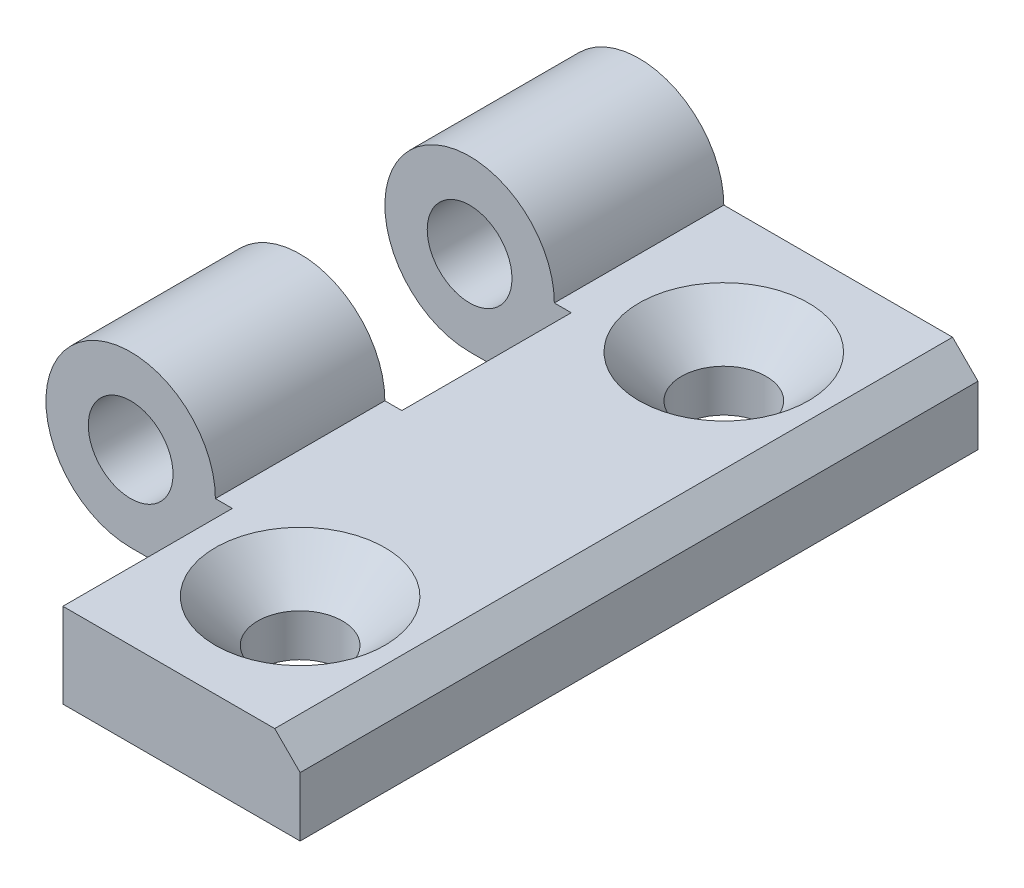
ISO-10303-21;
HEADER;
FILE_DESCRIPTION(('STEP AP214'),'2;1');
FILE_NAME('part.step','',(''),(''),'','','');
FILE_SCHEMA(('AUTOMOTIVE_DESIGN { 1 0 10303 214 1 1 1 1 }'));
ENDSEC;
DATA;
#1=APPLICATION_CONTEXT('core data for automotive mechanical design processes');
#2=APPLICATION_PROTOCOL_DEFINITION('international standard','automotive_design',2000,#1);
#3=PRODUCT_CONTEXT('',#1,'mechanical');
#4=PRODUCT('Part','Part','',(#3));
#5=PRODUCT_RELATED_PRODUCT_CATEGORY('part','',(#4));
#6=PRODUCT_DEFINITION_FORMATION('','',#4);
#7=PRODUCT_DEFINITION_CONTEXT('part definition',#1,'design');
#8=PRODUCT_DEFINITION('design','',#6,#7);
#9=PRODUCT_DEFINITION_SHAPE('','',#8);
#10=(LENGTH_UNIT() NAMED_UNIT(*) SI_UNIT(.MILLI.,.METRE.));
#11=(NAMED_UNIT(*) PLANE_ANGLE_UNIT() SI_UNIT($,.RADIAN.));
#12=(NAMED_UNIT(*) SI_UNIT($,.STERADIAN.) SOLID_ANGLE_UNIT());
#13=UNCERTAINTY_MEASURE_WITH_UNIT(LENGTH_MEASURE(1.E-05),#10,'distance_accuracy_value','');
#14=(GEOMETRIC_REPRESENTATION_CONTEXT(3) GLOBAL_UNCERTAINTY_ASSIGNED_CONTEXT((#13)) GLOBAL_UNIT_ASSIGNED_CONTEXT((#10,
#11,#12)) REPRESENTATION_CONTEXT('',''));
#15=CARTESIAN_POINT('',(0.,0.,0.));
#16=DIRECTION('',(0.,0.,1.));
#17=DIRECTION('',(1.,0.,0.));
#18=AXIS2_PLACEMENT_3D('',#15,#16,#17);
#19=CARTESIAN_POINT('',(-13.,2.5,40.));
#20=DIRECTION('',(0.,0.,-1.));
#21=DIRECTION('',(-1.,0.,0.));
#22=AXIS2_PLACEMENT_3D('',#19,#20,#21);
#23=CYLINDRICAL_SURFACE('',#22,5.);
#24=DIRECTION('',(0.,0.,-1.));
#25=VECTOR('',#24,1.);
#26=CARTESIAN_POINT('',(-13.,-2.5,40.));
#27=LINE('',#26,#25);
#28=CARTESIAN_POINT('',(-13.,-2.5,10.));
#29=VERTEX_POINT('',#28);
#30=CARTESIAN_POINT('',(-13.,-2.5,0.));
#31=VERTEX_POINT('',#30);
#32=EDGE_CURVE('E184',#29,#31,#27,.T.);
#33=ORIENTED_EDGE('',*,*,#32,.F.);
#34=CARTESIAN_POINT('',(-13.,2.5,10.));
#35=DIRECTION('',(0.,0.,1.));
#36=DIRECTION('',(1.,0.,0.));
#37=AXIS2_PLACEMENT_3D('',#34,#35,#36);
#38=CIRCLE('',#37,5.);
#39=CARTESIAN_POINT('',(-8.,2.5,10.));
#40=VERTEX_POINT('',#39);
#41=EDGE_CURVE('E222',#29,#40,#38,.F.);
#42=ORIENTED_EDGE('',*,*,#41,.T.);
#43=DIRECTION('',(0.,0.,-1.));
#44=VECTOR('',#43,1.);
#45=CARTESIAN_POINT('',(-8.,2.5,40.));
#46=LINE('',#45,#44);
#47=CARTESIAN_POINT('',(-8.,2.5,0.));
#48=VERTEX_POINT('',#47);
#49=EDGE_CURVE('E179',#40,#48,#46,.T.);
#50=ORIENTED_EDGE('',*,*,#49,.T.);
#51=CARTESIAN_POINT('',(-13.,2.5,0.));
#52=DIRECTION('',(0.,0.,-1.));
#53=DIRECTION('',(-1.,0.,0.));
#54=AXIS2_PLACEMENT_3D('',#51,#52,#53);
#55=CIRCLE('',#54,5.);
#56=EDGE_CURVE('E176',#31,#48,#55,.T.);
#57=ORIENTED_EDGE('',*,*,#56,.F.);
#58=EDGE_LOOP('',(#33,#42,#50,#57));
#59=FACE_BOUND('',#58,.T.);
#60=ADVANCED_FACE('F35',(#59),#23,.T.);
#61=CARTESIAN_POINT('',(-13.,2.5,40.));
#62=DIRECTION('',(0.,0.,-1.));
#63=DIRECTION('',(-1.,0.,0.));
#64=AXIS2_PLACEMENT_3D('',#61,#62,#63);
#65=CYLINDRICAL_SURFACE('',#64,2.5);
#66=CARTESIAN_POINT('',(-13.,2.5,0.));
#67=DIRECTION('',(0.,0.,-1.));
#68=DIRECTION('',(-1.,0.,0.));
#69=AXIS2_PLACEMENT_3D('',#66,#67,#68);
#70=CIRCLE('',#69,2.5);
#71=CARTESIAN_POINT('',(-15.5,2.5,0.));
#72=VERTEX_POINT('',#71);
#73=EDGE_CURVE('E173',#72,#72,#70,.T.);
#74=ORIENTED_EDGE('',*,*,#73,.T.);
#75=EDGE_LOOP('',(#74));
#76=FACE_BOUND('',#75,.T.);
#77=CARTESIAN_POINT('',(-13.,2.5,10.));
#78=DIRECTION('',(0.,0.,1.));
#79=DIRECTION('',(1.,0.,0.));
#80=AXIS2_PLACEMENT_3D('',#77,#78,#79);
#81=CIRCLE('',#80,2.5);
#82=CARTESIAN_POINT('',(-10.5,2.5,10.));
#83=VERTEX_POINT('',#82);
#84=EDGE_CURVE('E148',#83,#83,#81,.F.);
#85=ORIENTED_EDGE('',*,*,#84,.F.);
#86=EDGE_LOOP('',(#85));
#87=FACE_BOUND('',#86,.T.);
#88=ADVANCED_FACE('F254',(#76,#87),#65,.F.);
#89=CARTESIAN_POINT('',(-7.,2.5,40.));
#90=DIRECTION('',(0.,-1.,0.));
#91=DIRECTION('',(0.,0.,-1.));
#92=AXIS2_PLACEMENT_3D('',#89,#90,#91);
#93=PLANE('',#92);
#94=CARTESIAN_POINT('',(-0.500000000000004,2.5,32.5));
#95=DIRECTION('',(0.,1.,0.));
#96=DIRECTION('',(0.,0.,1.));
#97=AXIS2_PLACEMENT_3D('',#94,#95,#96);
#98=CIRCLE('',#97,5.);
#99=CARTESIAN_POINT('',(-0.500000000000004,2.5,37.5));
#100=VERTEX_POINT('',#99);
#101=EDGE_CURVE('E245',#100,#100,#98,.T.);
#102=ORIENTED_EDGE('',*,*,#101,.F.);
#103=EDGE_LOOP('',(#102));
#104=FACE_BOUND('',#103,.T.);
#105=CARTESIAN_POINT('',(-0.500000000000003,2.5,7.5));
#106=DIRECTION('',(0.,1.,0.));
#107=DIRECTION('',(0.,0.,1.));
#108=AXIS2_PLACEMENT_3D('',#105,#106,#107);
#109=CIRCLE('',#108,5.);
#110=CARTESIAN_POINT('',(-0.500000000000003,2.5,12.5));
#111=VERTEX_POINT('',#110);
#112=EDGE_CURVE('E236',#111,#111,#109,.T.);
#113=ORIENTED_EDGE('',*,*,#112,.F.);
#114=EDGE_LOOP('',(#113));
#115=FACE_BOUND('',#114,.T.);
#116=DIRECTION('',(-1.,0.,0.));
#117=VECTOR('',#116,1.);
#118=CARTESIAN_POINT('',(-7.,2.5,40.));
#119=LINE('',#118,#117);
#120=CARTESIAN_POINT('',(5.5,2.5,40.));
#121=VERTEX_POINT('',#120);
#122=CARTESIAN_POINT('',(-7.,2.5,40.));
#123=VERTEX_POINT('',#122);
#124=EDGE_CURVE('E189',#121,#123,#119,.T.);
#125=ORIENTED_EDGE('',*,*,#124,.F.);
#126=DIRECTION('',(0.,0.,-1.));
#127=VECTOR('',#126,1.);
#128=CARTESIAN_POINT('',(5.5,2.5,40.));
#129=LINE('',#128,#127);
#130=CARTESIAN_POINT('',(5.5,2.5,0.));
#131=VERTEX_POINT('',#130);
#132=EDGE_CURVE('E208',#121,#131,#129,.T.);
#133=ORIENTED_EDGE('',*,*,#132,.T.);
#134=DIRECTION('',(-1.,0.,0.));
#135=VECTOR('',#134,1.);
#136=CARTESIAN_POINT('',(-7.,2.5,0.));
#137=LINE('',#136,#135);
#138=EDGE_CURVE('E196',#131,#48,#137,.T.);
#139=ORIENTED_EDGE('',*,*,#138,.T.);
#140=ORIENTED_EDGE('',*,*,#49,.F.);
#141=DIRECTION('',(-1.,0.,0.));
#142=VECTOR('',#141,1.);
#143=CARTESIAN_POINT('',(-7.,2.5,10.));
#144=LINE('',#143,#142);
#145=CARTESIAN_POINT('',(-7.,2.5,10.));
#146=VERTEX_POINT('',#145);
#147=EDGE_CURVE('E146',#146,#40,#144,.T.);
#148=ORIENTED_EDGE('',*,*,#147,.F.);
#149=DIRECTION('',(0.,0.,1.));
#150=VECTOR('',#149,1.);
#151=CARTESIAN_POINT('',(-7.,2.5,40.));
#152=LINE('',#151,#150);
#153=CARTESIAN_POINT('',(-7.,2.5,20.));
#154=VERTEX_POINT('',#153);
#155=EDGE_CURVE('E134',#146,#154,#152,.T.);
#156=ORIENTED_EDGE('',*,*,#155,.T.);
#157=DIRECTION('',(-1.,0.,0.));
#158=VECTOR('',#157,1.);
#159=CARTESIAN_POINT('',(-7.,2.5,20.));
#160=LINE('',#159,#158);
#161=CARTESIAN_POINT('',(-8.,2.5,20.));
#162=VERTEX_POINT('',#161);
#163=EDGE_CURVE('E117',#154,#162,#160,.T.);
#164=ORIENTED_EDGE('',*,*,#163,.T.);
#165=CARTESIAN_POINT('',(-8.,2.5,30.));
#166=VERTEX_POINT('',#165);
#167=EDGE_CURVE('E185',#166,#162,#46,.T.);
#168=ORIENTED_EDGE('',*,*,#167,.F.);
#169=DIRECTION('',(-1.,0.,0.));
#170=VECTOR('',#169,1.);
#171=CARTESIAN_POINT('',(-7.,2.5,30.));
#172=LINE('',#171,#170);
#173=CARTESIAN_POINT('',(-7.,2.5,30.));
#174=VERTEX_POINT('',#173);
#175=EDGE_CURVE('E165',#174,#166,#172,.T.);
#176=ORIENTED_EDGE('',*,*,#175,.F.);
#177=DIRECTION('',(0.,0.,1.));
#178=VECTOR('',#177,1.);
#179=CARTESIAN_POINT('',(-7.,2.5,40.));
#180=LINE('',#179,#178);
#181=EDGE_CURVE('E170',#174,#123,#180,.T.);
#182=ORIENTED_EDGE('',*,*,#181,.T.);
#183=EDGE_LOOP('',(#125,#133,#139,#140,#148,#156,#164,#168,#176,#182));
#184=FACE_BOUND('',#183,.T.);
#185=ADVANCED_FACE('F144',(#104,#115,#184),#93,.F.);
#186=CARTESIAN_POINT('',(-7.,-2.5,40.));
#187=DIRECTION('',(0.,1.,0.));
#188=DIRECTION('',(0.,0.,1.));
#189=AXIS2_PLACEMENT_3D('',#186,#187,#188);
#190=PLANE('',#189);
#191=CARTESIAN_POINT('',(-0.500000000000004,-2.5,32.5));
#192=DIRECTION('',(0.,1.,0.));
#193=DIRECTION('',(0.,0.,1.));
#194=AXIS2_PLACEMENT_3D('',#191,#192,#193);
#195=CIRCLE('',#194,2.5);
#196=CARTESIAN_POINT('',(-0.500000000000004,-2.5,35.));
#197=VERTEX_POINT('',#196);
#198=EDGE_CURVE('E239',#197,#197,#195,.T.);
#199=ORIENTED_EDGE('',*,*,#198,.T.);
#200=EDGE_LOOP('',(#199));
#201=FACE_BOUND('',#200,.T.);
#202=CARTESIAN_POINT('',(-0.500000000000003,-2.5,7.5));
#203=DIRECTION('',(0.,1.,0.));
#204=DIRECTION('',(0.,0.,1.));
#205=AXIS2_PLACEMENT_3D('',#202,#203,#204);
#206=CIRCLE('',#205,2.5);
#207=CARTESIAN_POINT('',(-0.500000000000003,-2.5,10.));
#208=VERTEX_POINT('',#207);
#209=EDGE_CURVE('E140',#208,#208,#206,.T.);
#210=ORIENTED_EDGE('',*,*,#209,.T.);
#211=EDGE_LOOP('',(#210));
#212=FACE_BOUND('',#211,.T.);
#213=DIRECTION('',(1.,0.,0.));
#214=VECTOR('',#213,1.);
#215=CARTESIAN_POINT('',(-7.,-2.5,10.));
#216=LINE('',#215,#214);
#217=CARTESIAN_POINT('',(-7.,-2.5,10.));
#218=VERTEX_POINT('',#217);
#219=EDGE_CURVE('E206',#29,#218,#216,.T.);
#220=ORIENTED_EDGE('',*,*,#219,.F.);
#221=ORIENTED_EDGE('',*,*,#32,.T.);
#222=DIRECTION('',(1.,0.,0.));
#223=VECTOR('',#222,1.);
#224=CARTESIAN_POINT('',(-7.,-2.5,0.));
#225=LINE('',#224,#223);
#226=CARTESIAN_POINT('',(7.,-2.5,0.));
#227=VERTEX_POINT('',#226);
#228=EDGE_CURVE('E190',#31,#227,#225,.T.);
#229=ORIENTED_EDGE('',*,*,#228,.T.);
#230=DIRECTION('',(0.,0.,-1.));
#231=VECTOR('',#230,1.);
#232=CARTESIAN_POINT('',(7.,-2.5,40.));
#233=LINE('',#232,#231);
#234=CARTESIAN_POINT('',(7.,-2.5,40.));
#235=VERTEX_POINT('',#234);
#236=EDGE_CURVE('E194',#235,#227,#233,.T.);
#237=ORIENTED_EDGE('',*,*,#236,.F.);
#238=DIRECTION('',(1.,0.,0.));
#239=VECTOR('',#238,1.);
#240=CARTESIAN_POINT('',(-7.,-2.5,40.));
#241=LINE('',#240,#239);
#242=CARTESIAN_POINT('',(-7.,-2.5,40.));
#243=VERTEX_POINT('',#242);
#244=EDGE_CURVE('E192',#243,#235,#241,.T.);
#245=ORIENTED_EDGE('',*,*,#244,.F.);
#246=DIRECTION('',(0.,0.,-1.));
#247=VECTOR('',#246,1.);
#248=CARTESIAN_POINT('',(-7.,-2.5,40.));
#249=LINE('',#248,#247);
#250=CARTESIAN_POINT('',(-7.,-2.5,30.));
#251=VERTEX_POINT('',#250);
#252=EDGE_CURVE('E167',#243,#251,#249,.T.);
#253=ORIENTED_EDGE('',*,*,#252,.T.);
#254=DIRECTION('',(1.,0.,0.));
#255=VECTOR('',#254,1.);
#256=CARTESIAN_POINT('',(-7.,-2.5,30.));
#257=LINE('',#256,#255);
#258=CARTESIAN_POINT('',(-13.,-2.5,30.));
#259=VERTEX_POINT('',#258);
#260=EDGE_CURVE('E163',#259,#251,#257,.T.);
#261=ORIENTED_EDGE('',*,*,#260,.F.);
#262=CARTESIAN_POINT('',(-13.,-2.5,20.));
#263=VERTEX_POINT('',#262);
#264=EDGE_CURVE('E180',#259,#263,#27,.T.);
#265=ORIENTED_EDGE('',*,*,#264,.T.);
#266=DIRECTION('',(1.,0.,0.));
#267=VECTOR('',#266,1.);
#268=CARTESIAN_POINT('',(-7.,-2.5,20.));
#269=LINE('',#268,#267);
#270=CARTESIAN_POINT('',(-7.,-2.5,20.));
#271=VERTEX_POINT('',#270);
#272=EDGE_CURVE('E201',#263,#271,#269,.T.);
#273=ORIENTED_EDGE('',*,*,#272,.T.);
#274=DIRECTION('',(0.,0.,-1.));
#275=VECTOR('',#274,1.);
#276=CARTESIAN_POINT('',(-7.,-2.5,40.));
#277=LINE('',#276,#275);
#278=EDGE_CURVE('E137',#271,#218,#277,.T.);
#279=ORIENTED_EDGE('',*,*,#278,.T.);
#280=EDGE_LOOP('',(#220,#221,#229,#237,#245,#253,#261,#265,#273,#279));
#281=FACE_BOUND('',#280,.T.);
#282=ADVANCED_FACE('F253',(#201,#212,#281),#190,.F.);
#283=CARTESIAN_POINT('',(-13.,2.5,20.));
#284=DIRECTION('',(0.,0.,1.));
#285=DIRECTION('',(1.,0.,0.));
#286=AXIS2_PLACEMENT_3D('',#283,#284,#285);
#287=CIRCLE('',#286,5.);
#288=EDGE_CURVE('E124',#263,#162,#287,.F.);
#289=ORIENTED_EDGE('',*,*,#288,.F.);
#290=ORIENTED_EDGE('',*,*,#264,.F.);
#291=CARTESIAN_POINT('',(-13.,2.5,30.));
#292=DIRECTION('',(0.,0.,1.));
#293=DIRECTION('',(1.,0.,0.));
#294=AXIS2_PLACEMENT_3D('',#291,#292,#293);
#295=CIRCLE('',#294,5.);
#296=EDGE_CURVE('E160',#259,#166,#295,.F.);
#297=ORIENTED_EDGE('',*,*,#296,.T.);
#298=ORIENTED_EDGE('',*,*,#167,.T.);
#299=EDGE_LOOP('',(#289,#290,#297,#298));
#300=FACE_BOUND('',#299,.T.);
#301=ADVANCED_FACE('F275',(#300),#23,.T.);
#302=CARTESIAN_POINT('',(-13.,2.5,20.));
#303=DIRECTION('',(0.,0.,1.));
#304=DIRECTION('',(1.,0.,0.));
#305=AXIS2_PLACEMENT_3D('',#302,#303,#304);
#306=CIRCLE('',#305,2.5);
#307=CARTESIAN_POINT('',(-10.5,2.5,20.));
#308=VERTEX_POINT('',#307);
#309=EDGE_CURVE('E129',#308,#308,#306,.F.);
#310=ORIENTED_EDGE('',*,*,#309,.T.);
#311=EDGE_LOOP('',(#310));
#312=FACE_BOUND('',#311,.T.);
#313=CARTESIAN_POINT('',(-13.,2.5,30.));
#314=DIRECTION('',(0.,0.,1.));
#315=DIRECTION('',(1.,0.,0.));
#316=AXIS2_PLACEMENT_3D('',#313,#314,#315);
#317=CIRCLE('',#316,2.5);
#318=CARTESIAN_POINT('',(-10.5,2.5,30.));
#319=VERTEX_POINT('',#318);
#320=EDGE_CURVE('E158',#319,#319,#317,.F.);
#321=ORIENTED_EDGE('',*,*,#320,.F.);
#322=EDGE_LOOP('',(#321));
#323=FACE_BOUND('',#322,.T.);
#324=ADVANCED_FACE('F281',(#312,#323),#65,.F.);
#325=CARTESIAN_POINT('',(7.,2.5,40.));
#326=DIRECTION('',(-1.,0.,0.));
#327=DIRECTION('',(0.,-1.,0.));
#328=AXIS2_PLACEMENT_3D('',#325,#326,#327);
#329=PLANE('',#328);
#330=DIRECTION('',(0.,1.,0.));
#331=VECTOR('',#330,1.);
#332=CARTESIAN_POINT('',(7.,2.5,0.));
#333=LINE('',#332,#331);
#334=CARTESIAN_POINT('',(7.,0.999999999999999,0.));
#335=VERTEX_POINT('',#334);
#336=EDGE_CURVE('E183',#227,#335,#333,.T.);
#337=ORIENTED_EDGE('',*,*,#336,.T.);
#338=DIRECTION('',(0.,0.,1.));
#339=VECTOR('',#338,1.);
#340=CARTESIAN_POINT('',(7.,0.999999999999999,40.));
#341=LINE('',#340,#339);
#342=CARTESIAN_POINT('',(7.,0.999999999999998,40.));
#343=VERTEX_POINT('',#342);
#344=EDGE_CURVE('E43',#335,#343,#341,.T.);
#345=ORIENTED_EDGE('',*,*,#344,.T.);
#346=DIRECTION('',(0.,1.,0.));
#347=VECTOR('',#346,1.);
#348=CARTESIAN_POINT('',(7.,2.5,40.));
#349=LINE('',#348,#347);
#350=EDGE_CURVE('E187',#235,#343,#349,.T.);
#351=ORIENTED_EDGE('',*,*,#350,.F.);
#352=ORIENTED_EDGE('',*,*,#236,.T.);
#353=EDGE_LOOP('',(#337,#345,#351,#352));
#354=FACE_BOUND('',#353,.T.);
#355=ADVANCED_FACE('F289',(#354),#329,.F.);
#356=CARTESIAN_POINT('',(0.,0.,40.));
#357=DIRECTION('',(0.,0.,1.));
#358=DIRECTION('',(1.,0.,0.));
#359=AXIS2_PLACEMENT_3D('',#356,#357,#358);
#360=PLANE('',#359);
#361=ORIENTED_EDGE('',*,*,#350,.T.);
#362=DIRECTION('',(0.707106781186546,-0.707106781186549,0.));
#363=VECTOR('',#362,1.);
#364=CARTESIAN_POINT('',(4.00000000000001,3.99999999999999,40.));
#365=LINE('',#364,#363);
#366=EDGE_CURVE('E11',#343,#121,#365,.F.);
#367=ORIENTED_EDGE('',*,*,#366,.T.);
#368=ORIENTED_EDGE('',*,*,#124,.T.);
#369=DIRECTION('',(0.,1.,0.));
#370=VECTOR('',#369,1.);
#371=CARTESIAN_POINT('',(-7.,2.5,40.));
#372=LINE('',#371,#370);
#373=EDGE_CURVE('E147',#243,#123,#372,.T.);
#374=ORIENTED_EDGE('',*,*,#373,.F.);
#375=ORIENTED_EDGE('',*,*,#244,.T.);
#376=EDGE_LOOP('',(#361,#367,#368,#374,#375));
#377=FACE_BOUND('',#376,.T.);
#378=ADVANCED_FACE('F305',(#377),#360,.T.);
#379=CARTESIAN_POINT('',(0.,0.,0.));
#380=DIRECTION('',(0.,0.,1.));
#381=DIRECTION('',(1.,0.,0.));
#382=AXIS2_PLACEMENT_3D('',#379,#380,#381);
#383=PLANE('',#382);
#384=ORIENTED_EDGE('',*,*,#138,.F.);
#385=DIRECTION('',(-0.707106781186546,0.707106781186549,0.));
#386=VECTOR('',#385,1.);
#387=CARTESIAN_POINT('',(5.5,2.5,0.));
#388=LINE('',#387,#386);
#389=EDGE_CURVE('E57',#131,#335,#388,.F.);
#390=ORIENTED_EDGE('',*,*,#389,.T.);
#391=ORIENTED_EDGE('',*,*,#336,.F.);
#392=ORIENTED_EDGE('',*,*,#228,.F.);
#393=ORIENTED_EDGE('',*,*,#56,.T.);
#394=EDGE_LOOP('',(#384,#390,#391,#392,#393));
#395=FACE_BOUND('',#394,.T.);
#396=ORIENTED_EDGE('',*,*,#73,.F.);
#397=EDGE_LOOP('',(#396));
#398=FACE_BOUND('',#397,.T.);
#399=ADVANCED_FACE('F215',(#395,#398),#383,.F.);
#400=CARTESIAN_POINT('',(-7.,2.5,30.));
#401=DIRECTION('',(1.,0.,0.));
#402=DIRECTION('',(0.,0.,-1.));
#403=AXIS2_PLACEMENT_3D('',#400,#401,#402);
#404=PLANE('',#403);
#405=DIRECTION('',(0.,1.,0.));
#406=VECTOR('',#405,1.);
#407=CARTESIAN_POINT('',(-7.,-3.93420425084656,30.));
#408=LINE('',#407,#406);
#409=EDGE_CURVE('E151',#251,#174,#408,.T.);
#410=ORIENTED_EDGE('',*,*,#409,.F.);
#411=ORIENTED_EDGE('',*,*,#252,.F.);
#412=ORIENTED_EDGE('',*,*,#373,.T.);
#413=ORIENTED_EDGE('',*,*,#181,.F.);
#414=EDGE_LOOP('',(#410,#411,#412,#413));
#415=FACE_BOUND('',#414,.T.);
#416=ADVANCED_FACE('F302',(#415),#404,.F.);
#417=CARTESIAN_POINT('',(0.,0.,30.));
#418=DIRECTION('',(0.,0.,1.));
#419=DIRECTION('',(1.,0.,0.));
#420=AXIS2_PLACEMENT_3D('',#417,#418,#419);
#421=PLANE('',#420);
#422=ORIENTED_EDGE('',*,*,#320,.T.);
#423=EDGE_LOOP('',(#422));
#424=FACE_BOUND('',#423,.T.);
#425=ORIENTED_EDGE('',*,*,#175,.T.);
#426=ORIENTED_EDGE('',*,*,#296,.F.);
#427=ORIENTED_EDGE('',*,*,#260,.T.);
#428=ORIENTED_EDGE('',*,*,#409,.T.);
#429=EDGE_LOOP('',(#425,#426,#427,#428));
#430=FACE_BOUND('',#429,.T.);
#431=ADVANCED_FACE('F299',(#424,#430),#421,.T.);
#432=CARTESIAN_POINT('',(-7.,2.5,10.));
#433=DIRECTION('',(1.,0.,0.));
#434=DIRECTION('',(0.,0.,-1.));
#435=AXIS2_PLACEMENT_3D('',#432,#433,#434);
#436=PLANE('',#435);
#437=DIRECTION('',(0.,1.,0.));
#438=VECTOR('',#437,1.);
#439=CARTESIAN_POINT('',(-7.,-3.93420425084656,10.));
#440=LINE('',#439,#438);
#441=EDGE_CURVE('E139',#218,#146,#440,.T.);
#442=ORIENTED_EDGE('',*,*,#441,.F.);
#443=ORIENTED_EDGE('',*,*,#278,.F.);
#444=DIRECTION('',(0.,1.,0.));
#445=VECTOR('',#444,1.);
#446=CARTESIAN_POINT('',(-7.,2.5,20.));
#447=LINE('',#446,#445);
#448=EDGE_CURVE('E121',#271,#154,#447,.T.);
#449=ORIENTED_EDGE('',*,*,#448,.T.);
#450=ORIENTED_EDGE('',*,*,#155,.F.);
#451=EDGE_LOOP('',(#442,#443,#449,#450));
#452=FACE_BOUND('',#451,.T.);
#453=ADVANCED_FACE('F133',(#452),#436,.F.);
#454=CARTESIAN_POINT('',(0.,0.,10.));
#455=DIRECTION('',(0.,0.,1.));
#456=DIRECTION('',(1.,0.,0.));
#457=AXIS2_PLACEMENT_3D('',#454,#455,#456);
#458=PLANE('',#457);
#459=ORIENTED_EDGE('',*,*,#147,.T.);
#460=ORIENTED_EDGE('',*,*,#41,.F.);
#461=ORIENTED_EDGE('',*,*,#219,.T.);
#462=ORIENTED_EDGE('',*,*,#441,.T.);
#463=EDGE_LOOP('',(#459,#460,#461,#462));
#464=FACE_BOUND('',#463,.T.);
#465=ORIENTED_EDGE('',*,*,#84,.T.);
#466=EDGE_LOOP('',(#465));
#467=FACE_BOUND('',#466,.T.);
#468=ADVANCED_FACE('F349',(#464,#467),#458,.T.);
#469=CARTESIAN_POINT('',(0.,0.,20.));
#470=DIRECTION('',(0.,0.,1.));
#471=DIRECTION('',(1.,0.,0.));
#472=AXIS2_PLACEMENT_3D('',#469,#470,#471);
#473=PLANE('',#472);
#474=ORIENTED_EDGE('',*,*,#448,.F.);
#475=ORIENTED_EDGE('',*,*,#272,.F.);
#476=ORIENTED_EDGE('',*,*,#288,.T.);
#477=ORIENTED_EDGE('',*,*,#163,.F.);
#478=EDGE_LOOP('',(#474,#475,#476,#477));
#479=FACE_BOUND('',#478,.T.);
#480=ORIENTED_EDGE('',*,*,#309,.F.);
#481=EDGE_LOOP('',(#480));
#482=FACE_BOUND('',#481,.T.);
#483=ADVANCED_FACE('F119',(#479,#482),#473,.F.);
#484=CARTESIAN_POINT('',(-0.500000000000003,2.5,7.5));
#485=DIRECTION('',(0.,1.,0.));
#486=DIRECTION('',(0.,0.,1.));
#487=AXIS2_PLACEMENT_3D('',#484,#485,#486);
#488=CYLINDRICAL_SURFACE('',#487,2.5);
#489=ORIENTED_EDGE('',*,*,#209,.F.);
#490=EDGE_LOOP('',(#489));
#491=FACE_BOUND('',#490,.T.);
#492=CARTESIAN_POINT('',(-0.500000000000003,0.,7.5));
#493=DIRECTION('',(0.,1.,0.));
#494=DIRECTION('',(0.,0.,1.));
#495=AXIS2_PLACEMENT_3D('',#492,#493,#494);
#496=CIRCLE('',#495,2.5);
#497=CARTESIAN_POINT('',(-0.500000000000003,0.,10.));
#498=VERTEX_POINT('',#497);
#499=EDGE_CURVE('E233',#498,#498,#496,.T.);
#500=ORIENTED_EDGE('',*,*,#499,.T.);
#501=EDGE_LOOP('',(#500));
#502=FACE_BOUND('',#501,.T.);
#503=ADVANCED_FACE('F261',(#491,#502),#488,.F.);
#504=CARTESIAN_POINT('',(-0.500000000000003,2.5,7.5));
#505=DIRECTION('',(0.,1.,0.));
#506=DIRECTION('',(0.,0.,1.));
#507=AXIS2_PLACEMENT_3D('',#504,#505,#506);
#508=CONICAL_SURFACE('',#507,5.,0.785398163397449);
#509=ORIENTED_EDGE('',*,*,#499,.F.);
#510=EDGE_LOOP('',(#509));
#511=FACE_BOUND('',#510,.T.);
#512=ORIENTED_EDGE('',*,*,#112,.T.);
#513=EDGE_LOOP('',(#512));
#514=FACE_BOUND('',#513,.T.);
#515=ADVANCED_FACE('F258',(#511,#514),#508,.F.);
#516=CARTESIAN_POINT('',(-0.500000000000004,2.5,32.5));
#517=DIRECTION('',(0.,1.,0.));
#518=DIRECTION('',(0.,0.,1.));
#519=AXIS2_PLACEMENT_3D('',#516,#517,#518);
#520=CYLINDRICAL_SURFACE('',#519,2.5);
#521=ORIENTED_EDGE('',*,*,#198,.F.);
#522=EDGE_LOOP('',(#521));
#523=FACE_BOUND('',#522,.T.);
#524=CARTESIAN_POINT('',(-0.500000000000004,0.,32.5));
#525=DIRECTION('',(0.,1.,0.));
#526=DIRECTION('',(0.,0.,1.));
#527=AXIS2_PLACEMENT_3D('',#524,#525,#526);
#528=CIRCLE('',#527,2.5);
#529=CARTESIAN_POINT('',(-0.500000000000004,0.,35.));
#530=VERTEX_POINT('',#529);
#531=EDGE_CURVE('E242',#530,#530,#528,.T.);
#532=ORIENTED_EDGE('',*,*,#531,.T.);
#533=EDGE_LOOP('',(#532));
#534=FACE_BOUND('',#533,.T.);
#535=ADVANCED_FACE('F260',(#523,#534),#520,.F.);
#536=CARTESIAN_POINT('',(-0.500000000000004,2.5,32.5));
#537=DIRECTION('',(0.,1.,0.));
#538=DIRECTION('',(0.,0.,1.));
#539=AXIS2_PLACEMENT_3D('',#536,#537,#538);
#540=CONICAL_SURFACE('',#539,5.,0.785398163397449);
#541=ORIENTED_EDGE('',*,*,#531,.F.);
#542=EDGE_LOOP('',(#541));
#543=FACE_BOUND('',#542,.T.);
#544=ORIENTED_EDGE('',*,*,#101,.T.);
#545=EDGE_LOOP('',(#544));
#546=FACE_BOUND('',#545,.T.);
#547=ADVANCED_FACE('F249',(#543,#546),#540,.F.);
#548=CARTESIAN_POINT('',(5.5,2.5,40.));
#549=DIRECTION('',(-0.707106781186549,-0.707106781186546,0.));
#550=DIRECTION('',(0.,0.,-1.));
#551=AXIS2_PLACEMENT_3D('',#548,#549,#550);
#552=PLANE('',#551);
#553=ORIENTED_EDGE('',*,*,#366,.F.);
#554=ORIENTED_EDGE('',*,*,#344,.F.);
#555=ORIENTED_EDGE('',*,*,#389,.F.);
#556=ORIENTED_EDGE('',*,*,#132,.F.);
#557=EDGE_LOOP('',(#553,#554,#555,#556));
#558=FACE_BOUND('',#557,.T.);
#559=ADVANCED_FACE('F37',(#558),#552,.F.);
#560=CLOSED_SHELL('',(#60,#88,#185,#282,#301,#324,#355,#378,#399,#416,#431,#453,#468,#483,#503,
#515,#535,#547,#559));
#561=MANIFOLD_SOLID_BREP('B2',#560);
#562=ADVANCED_BREP_SHAPE_REPRESENTATION('',(#18,#561),#14);
#563=SHAPE_DEFINITION_REPRESENTATION(#9,#562);
ENDSEC;
END-ISO-10303-21;
